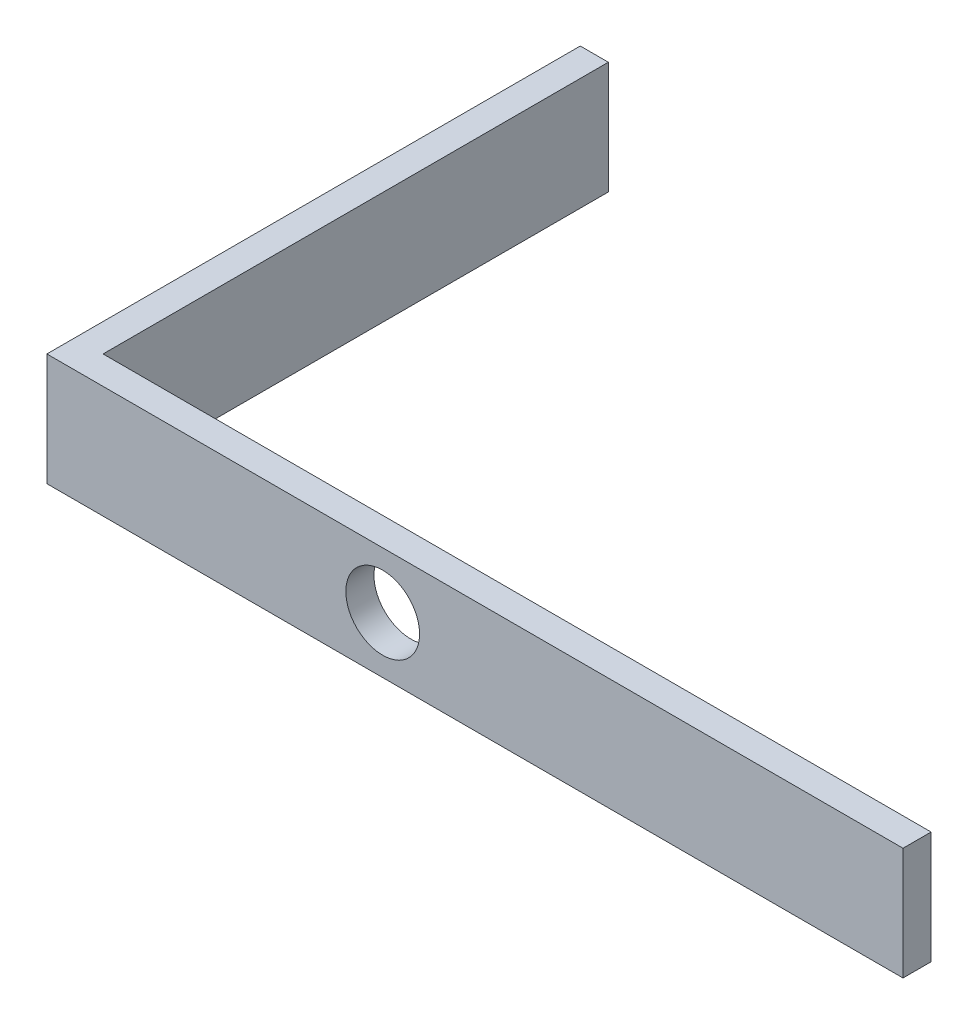
ISO-10303-21;
HEADER;
FILE_DESCRIPTION(('STEP AP214'),'2;1');
FILE_NAME('part.step','',(''),(''),'','','');
FILE_SCHEMA(('AUTOMOTIVE_DESIGN { 1 0 10303 214 1 1 1 1 }'));
ENDSEC;
DATA;
#1=APPLICATION_CONTEXT('core data for automotive mechanical design processes');
#2=APPLICATION_PROTOCOL_DEFINITION('international standard','automotive_design',2000,#1);
#3=PRODUCT_CONTEXT('',#1,'mechanical');
#4=PRODUCT('Part','Part','',(#3));
#5=PRODUCT_RELATED_PRODUCT_CATEGORY('part','',(#4));
#6=PRODUCT_DEFINITION_FORMATION('','',#4);
#7=PRODUCT_DEFINITION_CONTEXT('part definition',#1,'design');
#8=PRODUCT_DEFINITION('design','',#6,#7);
#9=PRODUCT_DEFINITION_SHAPE('','',#8);
#10=(LENGTH_UNIT() NAMED_UNIT(*) SI_UNIT(.MILLI.,.METRE.));
#11=(NAMED_UNIT(*) PLANE_ANGLE_UNIT() SI_UNIT($,.RADIAN.));
#12=(NAMED_UNIT(*) SI_UNIT($,.STERADIAN.) SOLID_ANGLE_UNIT());
#13=UNCERTAINTY_MEASURE_WITH_UNIT(LENGTH_MEASURE(1.E-05),#10,'distance_accuracy_value','');
#14=(GEOMETRIC_REPRESENTATION_CONTEXT(3) GLOBAL_UNCERTAINTY_ASSIGNED_CONTEXT((#13)) GLOBAL_UNIT_ASSIGNED_CONTEXT((#10,
#11,#12)) REPRESENTATION_CONTEXT('',''));
#15=CARTESIAN_POINT('',(0.,0.,0.));
#16=DIRECTION('',(0.,0.,1.));
#17=DIRECTION('',(1.,0.,0.));
#18=AXIS2_PLACEMENT_3D('',#15,#16,#17);
#19=CARTESIAN_POINT('',(0.,7.9375,0.));
#20=DIRECTION('',(1.,0.,0.));
#21=DIRECTION('',(0.,0.,-1.));
#22=AXIS2_PLACEMENT_3D('',#19,#20,#21);
#23=PLANE('',#22);
#24=DIRECTION('',(0.,0.,1.));
#25=VECTOR('',#24,1.);
#26=CARTESIAN_POINT('',(0.,-7.9375,0.));
#27=LINE('',#26,#25);
#28=CARTESIAN_POINT('',(0.,-7.9375,-75.34275));
#29=VERTEX_POINT('',#28);
#30=CARTESIAN_POINT('',(0.,-7.9375,0.));
#31=VERTEX_POINT('',#30);
#32=EDGE_CURVE('E122',#29,#31,#27,.T.);
#33=ORIENTED_EDGE('',*,*,#32,.T.);
#34=DIRECTION('',(0.,-1.,0.));
#35=VECTOR('',#34,1.);
#36=CARTESIAN_POINT('',(0.,7.9375,0.));
#37=LINE('',#36,#35);
#38=CARTESIAN_POINT('',(0.,7.9375,0.));
#39=VERTEX_POINT('',#38);
#40=EDGE_CURVE('E11',#39,#31,#37,.T.);
#41=ORIENTED_EDGE('',*,*,#40,.F.);
#42=DIRECTION('',(0.,0.,1.));
#43=VECTOR('',#42,1.);
#44=CARTESIAN_POINT('',(0.,7.9375,0.));
#45=LINE('',#44,#43);
#46=CARTESIAN_POINT('',(0.,7.9375,-75.34275));
#47=VERTEX_POINT('',#46);
#48=EDGE_CURVE('E133',#47,#39,#45,.T.);
#49=ORIENTED_EDGE('',*,*,#48,.F.);
#50=DIRECTION('',(0.,-1.,0.));
#51=VECTOR('',#50,1.);
#52=CARTESIAN_POINT('',(0.,7.9375,-75.34275));
#53=LINE('',#52,#51);
#54=EDGE_CURVE('E118',#47,#29,#53,.T.);
#55=ORIENTED_EDGE('',*,*,#54,.T.);
#56=EDGE_LOOP('',(#33,#41,#49,#55));
#57=FACE_BOUND('',#56,.T.);
#58=ADVANCED_FACE('F38',(#57),#23,.F.);
#59=CARTESIAN_POINT('',(3.96875,7.9375,0.));
#60=DIRECTION('',(0.,0.,-1.));
#61=DIRECTION('',(-1.,0.,0.));
#62=AXIS2_PLACEMENT_3D('',#59,#60,#61);
#63=PLANE('',#62);
#64=CARTESIAN_POINT('',(47.4345,0.,0.));
#65=DIRECTION('',(0.,0.,1.));
#66=DIRECTION('',(1.,0.,0.));
#67=AXIS2_PLACEMENT_3D('',#64,#65,#66);
#68=CIRCLE('',#67,5.207);
#69=CARTESIAN_POINT('',(52.6415,0.,0.));
#70=VERTEX_POINT('',#69);
#71=EDGE_CURVE('E175',#70,#70,#68,.T.);
#72=ORIENTED_EDGE('',*,*,#71,.F.);
#73=EDGE_LOOP('',(#72));
#74=FACE_BOUND('',#73,.T.);
#75=DIRECTION('',(1.,0.,0.));
#76=VECTOR('',#75,1.);
#77=CARTESIAN_POINT('',(3.96875,-7.9375,0.));
#78=LINE('',#77,#76);
#79=CARTESIAN_POINT('',(120.93575,-7.9375,0.));
#80=VERTEX_POINT('',#79);
#81=EDGE_CURVE('E125',#31,#80,#78,.T.);
#82=ORIENTED_EDGE('',*,*,#81,.T.);
#83=DIRECTION('',(0.,-1.,0.));
#84=VECTOR('',#83,1.);
#85=CARTESIAN_POINT('',(120.93575,7.9375,0.));
#86=LINE('',#85,#84);
#87=CARTESIAN_POINT('',(120.93575,7.9375,0.));
#88=VERTEX_POINT('',#87);
#89=EDGE_CURVE('E46',#88,#80,#86,.T.);
#90=ORIENTED_EDGE('',*,*,#89,.F.);
#91=DIRECTION('',(1.,0.,0.));
#92=VECTOR('',#91,1.);
#93=CARTESIAN_POINT('',(0.,7.9375,0.));
#94=LINE('',#93,#92);
#95=EDGE_CURVE('E91',#39,#88,#94,.T.);
#96=ORIENTED_EDGE('',*,*,#95,.F.);
#97=ORIENTED_EDGE('',*,*,#40,.T.);
#98=EDGE_LOOP('',(#82,#90,#96,#97));
#99=FACE_BOUND('',#98,.T.);
#100=ADVANCED_FACE('F157',(#74,#99),#63,.F.);
#101=CARTESIAN_POINT('',(120.93575,7.9375,0.));
#102=DIRECTION('',(-1.,0.,0.));
#103=DIRECTION('',(0.,0.,1.));
#104=AXIS2_PLACEMENT_3D('',#101,#102,#103);
#105=PLANE('',#104);
#106=DIRECTION('',(0.,0.,-1.));
#107=VECTOR('',#106,1.);
#108=CARTESIAN_POINT('',(120.93575,-7.9375,0.));
#109=LINE('',#108,#107);
#110=CARTESIAN_POINT('',(120.93575,-7.9375,-3.96875000000001));
#111=VERTEX_POINT('',#110);
#112=EDGE_CURVE('E128',#80,#111,#109,.T.);
#113=ORIENTED_EDGE('',*,*,#112,.T.);
#114=DIRECTION('',(0.,-1.,0.));
#115=VECTOR('',#114,1.);
#116=CARTESIAN_POINT('',(120.93575,7.9375,-3.96875000000001));
#117=LINE('',#116,#115);
#118=CARTESIAN_POINT('',(120.93575,7.9375,-3.96875000000001));
#119=VERTEX_POINT('',#118);
#120=EDGE_CURVE('E113',#119,#111,#117,.T.);
#121=ORIENTED_EDGE('',*,*,#120,.F.);
#122=DIRECTION('',(0.,0.,-1.));
#123=VECTOR('',#122,1.);
#124=CARTESIAN_POINT('',(120.93575,7.9375,0.));
#125=LINE('',#124,#123);
#126=EDGE_CURVE('E104',#88,#119,#125,.T.);
#127=ORIENTED_EDGE('',*,*,#126,.F.);
#128=ORIENTED_EDGE('',*,*,#89,.T.);
#129=EDGE_LOOP('',(#113,#121,#127,#128));
#130=FACE_BOUND('',#129,.T.);
#131=ADVANCED_FACE('F139',(#130),#105,.F.);
#132=CARTESIAN_POINT('',(3.96875,7.9375,-3.96875));
#133=DIRECTION('',(0.,0.,1.));
#134=DIRECTION('',(1.,0.,0.));
#135=AXIS2_PLACEMENT_3D('',#132,#133,#134);
#136=PLANE('',#135);
#137=CARTESIAN_POINT('',(47.4345,0.,-3.96875));
#138=DIRECTION('',(0.,0.,1.));
#139=DIRECTION('',(1.,0.,0.));
#140=AXIS2_PLACEMENT_3D('',#137,#138,#139);
#141=CIRCLE('',#140,5.207);
#142=CARTESIAN_POINT('',(52.6415,0.,-3.96875));
#143=VERTEX_POINT('',#142);
#144=EDGE_CURVE('E126',#143,#143,#141,.F.);
#145=ORIENTED_EDGE('',*,*,#144,.F.);
#146=EDGE_LOOP('',(#145));
#147=FACE_BOUND('',#146,.T.);
#148=DIRECTION('',(-1.,0.,0.));
#149=VECTOR('',#148,1.);
#150=CARTESIAN_POINT('',(3.96875,-7.9375,-3.96875));
#151=LINE('',#150,#149);
#152=CARTESIAN_POINT('',(3.96875,-7.9375,-3.96875));
#153=VERTEX_POINT('',#152);
#154=EDGE_CURVE('E112',#111,#153,#151,.T.);
#155=ORIENTED_EDGE('',*,*,#154,.T.);
#156=DIRECTION('',(0.,-1.,0.));
#157=VECTOR('',#156,1.);
#158=CARTESIAN_POINT('',(3.96875,7.9375,-3.96875));
#159=LINE('',#158,#157);
#160=CARTESIAN_POINT('',(3.96875,7.9375,-3.96875));
#161=VERTEX_POINT('',#160);
#162=EDGE_CURVE('E109',#161,#153,#159,.T.);
#163=ORIENTED_EDGE('',*,*,#162,.F.);
#164=DIRECTION('',(-1.,0.,0.));
#165=VECTOR('',#164,1.);
#166=CARTESIAN_POINT('',(3.96875,7.9375,-3.96875));
#167=LINE('',#166,#165);
#168=EDGE_CURVE('E98',#119,#161,#167,.T.);
#169=ORIENTED_EDGE('',*,*,#168,.F.);
#170=ORIENTED_EDGE('',*,*,#120,.T.);
#171=EDGE_LOOP('',(#155,#163,#169,#170));
#172=FACE_BOUND('',#171,.T.);
#173=ADVANCED_FACE('F110',(#147,#172),#136,.F.);
#174=CARTESIAN_POINT('',(3.96875,7.9375,-3.96875));
#175=DIRECTION('',(-1.,0.,0.));
#176=DIRECTION('',(0.,0.,1.));
#177=AXIS2_PLACEMENT_3D('',#174,#175,#176);
#178=PLANE('',#177);
#179=DIRECTION('',(0.,0.,-1.));
#180=VECTOR('',#179,1.);
#181=CARTESIAN_POINT('',(3.96875,-7.9375,-3.96875));
#182=LINE('',#181,#180);
#183=CARTESIAN_POINT('',(3.96875,-7.9375,-75.34275));
#184=VERTEX_POINT('',#183);
#185=EDGE_CURVE('E77',#153,#184,#182,.T.);
#186=ORIENTED_EDGE('',*,*,#185,.T.);
#187=DIRECTION('',(0.,-1.,0.));
#188=VECTOR('',#187,1.);
#189=CARTESIAN_POINT('',(3.96875,7.9375,-75.34275));
#190=LINE('',#189,#188);
#191=CARTESIAN_POINT('',(3.96875,7.9375,-75.34275));
#192=VERTEX_POINT('',#191);
#193=EDGE_CURVE('E114',#192,#184,#190,.T.);
#194=ORIENTED_EDGE('',*,*,#193,.F.);
#195=DIRECTION('',(0.,0.,-1.));
#196=VECTOR('',#195,1.);
#197=CARTESIAN_POINT('',(3.96875,7.9375,-3.96875));
#198=LINE('',#197,#196);
#199=EDGE_CURVE('E102',#161,#192,#198,.T.);
#200=ORIENTED_EDGE('',*,*,#199,.F.);
#201=ORIENTED_EDGE('',*,*,#162,.T.);
#202=EDGE_LOOP('',(#186,#194,#200,#201));
#203=FACE_BOUND('',#202,.T.);
#204=ADVANCED_FACE('F116',(#203),#178,.F.);
#205=CARTESIAN_POINT('',(0.,7.9375,-75.34275));
#206=DIRECTION('',(0.,0.,1.));
#207=DIRECTION('',(1.,0.,0.));
#208=AXIS2_PLACEMENT_3D('',#205,#206,#207);
#209=PLANE('',#208);
#210=DIRECTION('',(-1.,0.,0.));
#211=VECTOR('',#210,1.);
#212=CARTESIAN_POINT('',(0.,-7.9375,-75.34275));
#213=LINE('',#212,#211);
#214=EDGE_CURVE('E83',#184,#29,#213,.T.);
#215=ORIENTED_EDGE('',*,*,#214,.T.);
#216=ORIENTED_EDGE('',*,*,#54,.F.);
#217=DIRECTION('',(-1.,0.,0.));
#218=VECTOR('',#217,1.);
#219=CARTESIAN_POINT('',(0.,7.9375,-75.34275));
#220=LINE('',#219,#218);
#221=EDGE_CURVE('E54',#192,#47,#220,.T.);
#222=ORIENTED_EDGE('',*,*,#221,.F.);
#223=ORIENTED_EDGE('',*,*,#193,.T.);
#224=EDGE_LOOP('',(#215,#216,#222,#223));
#225=FACE_BOUND('',#224,.T.);
#226=ADVANCED_FACE('F146',(#225),#209,.F.);
#227=CARTESIAN_POINT('',(0.,7.9375,0.));
#228=DIRECTION('',(0.,-1.,0.));
#229=DIRECTION('',(0.,0.,-1.));
#230=AXIS2_PLACEMENT_3D('',#227,#228,#229);
#231=PLANE('',#230);
#232=ORIENTED_EDGE('',*,*,#48,.T.);
#233=ORIENTED_EDGE('',*,*,#95,.T.);
#234=ORIENTED_EDGE('',*,*,#126,.T.);
#235=ORIENTED_EDGE('',*,*,#168,.T.);
#236=ORIENTED_EDGE('',*,*,#199,.T.);
#237=ORIENTED_EDGE('',*,*,#221,.T.);
#238=EDGE_LOOP('',(#232,#233,#234,#235,#236,#237));
#239=FACE_BOUND('',#238,.T.);
#240=ADVANCED_FACE('F100',(#239),#231,.F.);
#241=CARTESIAN_POINT('',(0.,-7.9375,0.));
#242=DIRECTION('',(0.,-1.,0.));
#243=DIRECTION('',(0.,0.,-1.));
#244=AXIS2_PLACEMENT_3D('',#241,#242,#243);
#245=PLANE('',#244);
#246=ORIENTED_EDGE('',*,*,#32,.F.);
#247=ORIENTED_EDGE('',*,*,#214,.F.);
#248=ORIENTED_EDGE('',*,*,#185,.F.);
#249=ORIENTED_EDGE('',*,*,#154,.F.);
#250=ORIENTED_EDGE('',*,*,#112,.F.);
#251=ORIENTED_EDGE('',*,*,#81,.F.);
#252=EDGE_LOOP('',(#246,#247,#248,#249,#250,#251));
#253=FACE_BOUND('',#252,.T.);
#254=ADVANCED_FACE('F142',(#253),#245,.T.);
#255=CARTESIAN_POINT('',(47.4345,0.,-18.6963700385534));
#256=DIRECTION('',(0.,0.,1.));
#257=DIRECTION('',(1.,0.,0.));
#258=AXIS2_PLACEMENT_3D('',#255,#256,#257);
#259=CYLINDRICAL_SURFACE('',#258,5.207);
#260=ORIENTED_EDGE('',*,*,#144,.T.);
#261=EDGE_LOOP('',(#260));
#262=FACE_BOUND('',#261,.T.);
#263=ORIENTED_EDGE('',*,*,#71,.T.);
#264=EDGE_LOOP('',(#263));
#265=FACE_BOUND('',#264,.T.);
#266=ADVANCED_FACE('F182',(#262,#265),#259,.F.);
#267=CLOSED_SHELL('',(#58,#100,#131,#173,#204,#226,#240,#254,#266));
#268=MANIFOLD_SOLID_BREP('B2',#267);
#269=ADVANCED_BREP_SHAPE_REPRESENTATION('',(#18,#268),#14);
#270=SHAPE_DEFINITION_REPRESENTATION(#9,#269);
ENDSEC;
END-ISO-10303-21;
